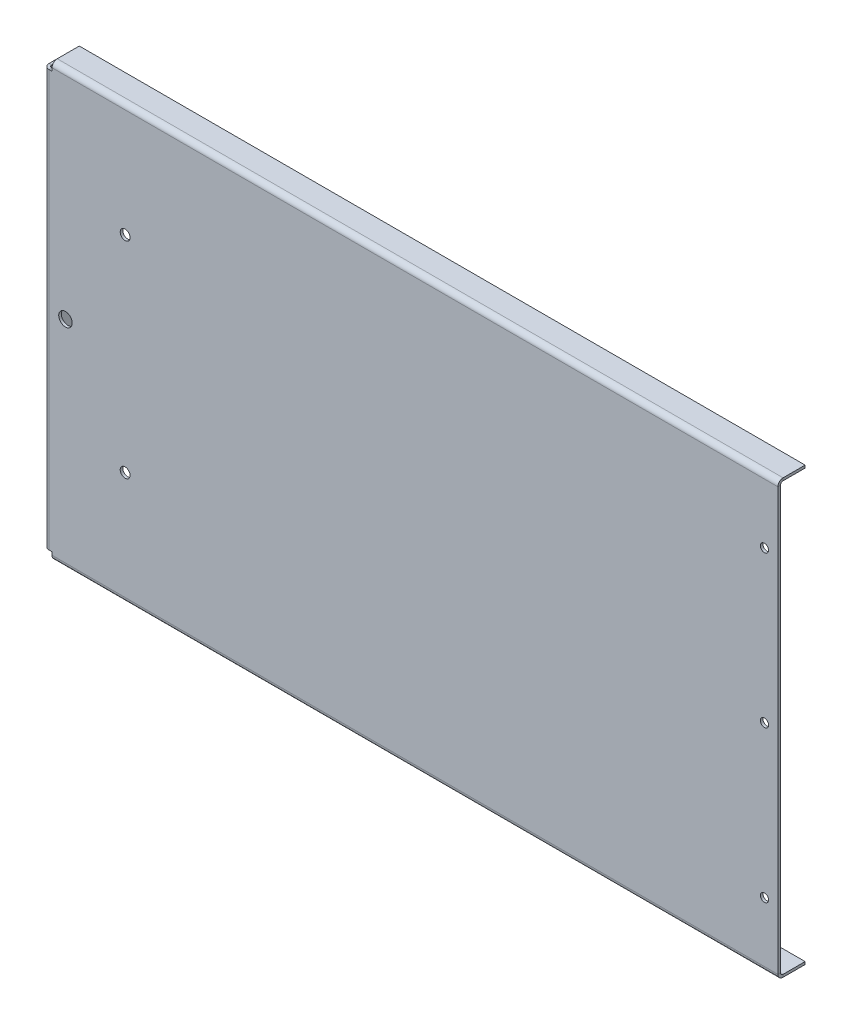
ISO-10303-21;
HEADER;
FILE_DESCRIPTION(('STEP AP214'),'2;1');
FILE_NAME('part.step','',(''),(''),'','','');
FILE_SCHEMA(('AUTOMOTIVE_DESIGN { 1 0 10303 214 1 1 1 1 }'));
ENDSEC;
DATA;
#1=APPLICATION_CONTEXT('core data for automotive mechanical design processes');
#2=APPLICATION_PROTOCOL_DEFINITION('international standard','automotive_design',2000,#1);
#3=PRODUCT_CONTEXT('',#1,'mechanical');
#4=PRODUCT('Part','Part','',(#3));
#5=PRODUCT_RELATED_PRODUCT_CATEGORY('part','',(#4));
#6=PRODUCT_DEFINITION_FORMATION('','',#4);
#7=PRODUCT_DEFINITION_CONTEXT('part definition',#1,'design');
#8=PRODUCT_DEFINITION('design','',#6,#7);
#9=PRODUCT_DEFINITION_SHAPE('','',#8);
#10=(LENGTH_UNIT() NAMED_UNIT(*) SI_UNIT(.MILLI.,.METRE.));
#11=(NAMED_UNIT(*) PLANE_ANGLE_UNIT() SI_UNIT($,.RADIAN.));
#12=(NAMED_UNIT(*) SI_UNIT($,.STERADIAN.) SOLID_ANGLE_UNIT());
#13=UNCERTAINTY_MEASURE_WITH_UNIT(LENGTH_MEASURE(1.E-05),#10,'distance_accuracy_value','');
#14=(GEOMETRIC_REPRESENTATION_CONTEXT(3) GLOBAL_UNCERTAINTY_ASSIGNED_CONTEXT((#13)) GLOBAL_UNIT_ASSIGNED_CONTEXT((#10,
#11,#12)) REPRESENTATION_CONTEXT('',''));
#15=CARTESIAN_POINT('',(0.,0.,0.));
#16=DIRECTION('',(0.,0.,1.));
#17=DIRECTION('',(1.,0.,0.));
#18=AXIS2_PLACEMENT_3D('',#15,#16,#17);
#19=CARTESIAN_POINT('',(0.,0.,-1.524));
#20=DIRECTION('',(0.,0.,-1.));
#21=DIRECTION('',(-1.,0.,0.));
#22=AXIS2_PLACEMENT_3D('',#19,#20,#21);
#23=PLANE('',#22);
#24=CARTESIAN_POINT('',(-202.819,0.,-1.524));
#25=DIRECTION('',(0.,0.,-1.));
#26=DIRECTION('',(-1.,0.,0.));
#27=AXIS2_PLACEMENT_3D('',#24,#25,#26);
#28=CIRCLE('',#27,3.9624);
#29=CARTESIAN_POINT('',(-206.7814,0.,-1.524));
#30=VERTEX_POINT('',#29);
#31=EDGE_CURVE('E571',#30,#30,#28,.F.);
#32=ORIENTED_EDGE('',*,*,#31,.T.);
#33=EDGE_LOOP('',(#32));
#34=FACE_BOUND('',#33,.T.);
#35=CARTESIAN_POINT('',(-167.767,60.452,-1.524));
#36=DIRECTION('',(0.,0.,-1.));
#37=DIRECTION('',(-1.,0.,0.));
#38=AXIS2_PLACEMENT_3D('',#35,#36,#37);
#39=CIRCLE('',#38,2.8956);
#40=CARTESIAN_POINT('',(-170.6626,60.452,-1.524));
#41=VERTEX_POINT('',#40);
#42=EDGE_CURVE('E567',#41,#41,#39,.F.);
#43=ORIENTED_EDGE('',*,*,#42,.T.);
#44=EDGE_LOOP('',(#43));
#45=FACE_BOUND('',#44,.T.);
#46=CARTESIAN_POINT('',(-167.767,-60.452,-1.524));
#47=DIRECTION('',(0.,0.,-1.));
#48=DIRECTION('',(-1.,0.,0.));
#49=AXIS2_PLACEMENT_3D('',#46,#47,#48);
#50=CIRCLE('',#49,2.8956);
#51=CARTESIAN_POINT('',(-170.6626,-60.452,-1.524));
#52=VERTEX_POINT('',#51);
#53=EDGE_CURVE('E559',#52,#52,#50,.F.);
#54=ORIENTED_EDGE('',*,*,#53,.T.);
#55=EDGE_LOOP('',(#54));
#56=FACE_BOUND('',#55,.T.);
#57=CARTESIAN_POINT('',(207.645,88.9,-1.524));
#58=DIRECTION('',(0.,0.,-1.));
#59=DIRECTION('',(-1.,0.,0.));
#60=AXIS2_PLACEMENT_3D('',#57,#58,#59);
#61=CIRCLE('',#60,2.41299999999999);
#62=CARTESIAN_POINT('',(205.232,88.9,-1.524));
#63=VERTEX_POINT('',#62);
#64=EDGE_CURVE('E551',#63,#63,#61,.F.);
#65=ORIENTED_EDGE('',*,*,#64,.T.);
#66=EDGE_LOOP('',(#65));
#67=FACE_BOUND('',#66,.T.);
#68=CARTESIAN_POINT('',(207.645,0.,-1.524));
#69=DIRECTION('',(0.,0.,-1.));
#70=DIRECTION('',(-1.,0.,0.));
#71=AXIS2_PLACEMENT_3D('',#68,#69,#70);
#72=CIRCLE('',#71,2.413);
#73=CARTESIAN_POINT('',(205.232,0.,-1.524));
#74=VERTEX_POINT('',#73);
#75=EDGE_CURVE('E543',#74,#74,#72,.F.);
#76=ORIENTED_EDGE('',*,*,#75,.T.);
#77=EDGE_LOOP('',(#76));
#78=FACE_BOUND('',#77,.T.);
#79=CARTESIAN_POINT('',(207.645,-88.9,-1.524));
#80=DIRECTION('',(0.,0.,-1.));
#81=DIRECTION('',(-1.,0.,0.));
#82=AXIS2_PLACEMENT_3D('',#79,#80,#81);
#83=CIRCLE('',#82,2.41299999999999);
#84=CARTESIAN_POINT('',(205.232,-88.9,-1.524));
#85=VERTEX_POINT('',#84);
#86=EDGE_CURVE('E535',#85,#85,#83,.F.);
#87=ORIENTED_EDGE('',*,*,#86,.T.);
#88=EDGE_LOOP('',(#87));
#89=FACE_BOUND('',#88,.T.);
#90=DIRECTION('',(-1.,0.,0.));
#91=VECTOR('',#90,1.);
#92=CARTESIAN_POINT('',(-215.519,-122.174,-1.524));
#93=LINE('',#92,#91);
#94=CARTESIAN_POINT('',(-210.693,-122.174,-1.524));
#95=VERTEX_POINT('',#94);
#96=CARTESIAN_POINT('',(-212.471,-122.174,-1.524));
#97=VERTEX_POINT('',#96);
#98=EDGE_CURVE('E502',#95,#97,#93,.T.);
#99=ORIENTED_EDGE('',*,*,#98,.T.);
#100=DIRECTION('',(0.,1.,0.));
#101=VECTOR('',#100,1.);
#102=CARTESIAN_POINT('',(-212.471,122.174,-1.524));
#103=LINE('',#102,#101);
#104=CARTESIAN_POINT('',(-212.471,122.174,-1.524));
#105=VERTEX_POINT('',#104);
#106=EDGE_CURVE('E315',#105,#97,#103,.F.);
#107=ORIENTED_EDGE('',*,*,#106,.F.);
#108=DIRECTION('',(1.,0.,0.));
#109=VECTOR('',#108,1.);
#110=CARTESIAN_POINT('',(-215.519,122.174,-1.524));
#111=LINE('',#110,#109);
#112=CARTESIAN_POINT('',(-210.693,122.174,-1.524));
#113=VERTEX_POINT('',#112);
#114=EDGE_CURVE('E490',#105,#113,#111,.T.);
#115=ORIENTED_EDGE('',*,*,#114,.T.);
#116=DIRECTION('',(0.,1.,0.));
#117=VECTOR('',#116,1.);
#118=CARTESIAN_POINT('',(-210.693,127.,-1.524));
#119=LINE('',#118,#117);
#120=CARTESIAN_POINT('',(-210.693,123.952,-1.524));
#121=VERTEX_POINT('',#120);
#122=EDGE_CURVE('E475',#113,#121,#119,.T.);
#123=ORIENTED_EDGE('',*,*,#122,.T.);
#124=DIRECTION('',(1.,0.,0.));
#125=VECTOR('',#124,1.);
#126=CARTESIAN_POINT('',(215.519,123.952,-1.524));
#127=LINE('',#126,#125);
#128=CARTESIAN_POINT('',(215.519,123.952,-1.524));
#129=VERTEX_POINT('',#128);
#130=EDGE_CURVE('E461',#129,#121,#127,.F.);
#131=ORIENTED_EDGE('',*,*,#130,.F.);
#132=DIRECTION('',(0.,1.,0.));
#133=VECTOR('',#132,1.);
#134=CARTESIAN_POINT('',(215.519,-127.,-1.524));
#135=LINE('',#134,#133);
#136=CARTESIAN_POINT('',(215.519,-123.952,-1.524));
#137=VERTEX_POINT('',#136);
#138=EDGE_CURVE('E13',#137,#129,#135,.T.);
#139=ORIENTED_EDGE('',*,*,#138,.F.);
#140=DIRECTION('',(-1.,0.,0.));
#141=VECTOR('',#140,1.);
#142=CARTESIAN_POINT('',(-210.693,-123.952,-1.524));
#143=LINE('',#142,#141);
#144=CARTESIAN_POINT('',(-210.693,-123.952,-1.524));
#145=VERTEX_POINT('',#144);
#146=EDGE_CURVE('E387',#145,#137,#143,.F.);
#147=ORIENTED_EDGE('',*,*,#146,.F.);
#148=DIRECTION('',(0.,1.,0.));
#149=VECTOR('',#148,1.);
#150=CARTESIAN_POINT('',(-210.693,-127.,-1.524));
#151=LINE('',#150,#149);
#152=EDGE_CURVE('E480',#145,#95,#151,.T.);
#153=ORIENTED_EDGE('',*,*,#152,.T.);
#154=EDGE_LOOP('',(#99,#107,#115,#123,#131,#139,#147,#153));
#155=FACE_BOUND('',#154,.T.);
#156=ADVANCED_FACE('F107',(#34,#45,#56,#67,#78,#89,#155),#23,.T.);
#157=CARTESIAN_POINT('',(0.,0.,0.));
#158=DIRECTION('',(0.,0.,-1.));
#159=DIRECTION('',(-1.,0.,0.));
#160=AXIS2_PLACEMENT_3D('',#157,#158,#159);
#161=PLANE('',#160);
#162=CARTESIAN_POINT('',(-202.819,0.,0.));
#163=DIRECTION('',(0.,0.,1.));
#164=DIRECTION('',(1.,0.,0.));
#165=AXIS2_PLACEMENT_3D('',#162,#163,#164);
#166=CIRCLE('',#165,3.9624);
#167=CARTESIAN_POINT('',(-198.8566,0.,0.));
#168=VERTEX_POINT('',#167);
#169=EDGE_CURVE('E299',#168,#168,#166,.T.);
#170=ORIENTED_EDGE('',*,*,#169,.F.);
#171=EDGE_LOOP('',(#170));
#172=FACE_BOUND('',#171,.T.);
#173=CARTESIAN_POINT('',(-167.767,60.452,0.));
#174=DIRECTION('',(0.,0.,1.));
#175=DIRECTION('',(1.,0.,0.));
#176=AXIS2_PLACEMENT_3D('',#173,#174,#175);
#177=CIRCLE('',#176,2.8956);
#178=CARTESIAN_POINT('',(-164.8714,60.452,0.));
#179=VERTEX_POINT('',#178);
#180=EDGE_CURVE('E563',#179,#179,#177,.T.);
#181=ORIENTED_EDGE('',*,*,#180,.F.);
#182=EDGE_LOOP('',(#181));
#183=FACE_BOUND('',#182,.T.);
#184=CARTESIAN_POINT('',(-167.767,-60.452,0.));
#185=DIRECTION('',(0.,0.,1.));
#186=DIRECTION('',(1.,0.,0.));
#187=AXIS2_PLACEMENT_3D('',#184,#185,#186);
#188=CIRCLE('',#187,2.8956);
#189=CARTESIAN_POINT('',(-164.8714,-60.452,0.));
#190=VERTEX_POINT('',#189);
#191=EDGE_CURVE('E555',#190,#190,#188,.T.);
#192=ORIENTED_EDGE('',*,*,#191,.F.);
#193=EDGE_LOOP('',(#192));
#194=FACE_BOUND('',#193,.T.);
#195=CARTESIAN_POINT('',(207.645,88.9,0.));
#196=DIRECTION('',(0.,0.,1.));
#197=DIRECTION('',(1.,0.,0.));
#198=AXIS2_PLACEMENT_3D('',#195,#196,#197);
#199=CIRCLE('',#198,2.41299999999999);
#200=CARTESIAN_POINT('',(210.058,88.9,0.));
#201=VERTEX_POINT('',#200);
#202=EDGE_CURVE('E547',#201,#201,#199,.T.);
#203=ORIENTED_EDGE('',*,*,#202,.F.);
#204=EDGE_LOOP('',(#203));
#205=FACE_BOUND('',#204,.T.);
#206=CARTESIAN_POINT('',(207.645,0.,0.));
#207=DIRECTION('',(0.,0.,1.));
#208=DIRECTION('',(1.,0.,0.));
#209=AXIS2_PLACEMENT_3D('',#206,#207,#208);
#210=CIRCLE('',#209,2.413);
#211=CARTESIAN_POINT('',(210.058,0.,0.));
#212=VERTEX_POINT('',#211);
#213=EDGE_CURVE('E539',#212,#212,#210,.T.);
#214=ORIENTED_EDGE('',*,*,#213,.F.);
#215=EDGE_LOOP('',(#214));
#216=FACE_BOUND('',#215,.T.);
#217=CARTESIAN_POINT('',(207.645,-88.9,0.));
#218=DIRECTION('',(0.,0.,1.));
#219=DIRECTION('',(1.,0.,0.));
#220=AXIS2_PLACEMENT_3D('',#217,#218,#219);
#221=CIRCLE('',#220,2.41299999999999);
#222=CARTESIAN_POINT('',(210.058,-88.9,0.));
#223=VERTEX_POINT('',#222);
#224=EDGE_CURVE('E531',#223,#223,#221,.T.);
#225=ORIENTED_EDGE('',*,*,#224,.F.);
#226=EDGE_LOOP('',(#225));
#227=FACE_BOUND('',#226,.T.);
#228=DIRECTION('',(0.,1.,0.));
#229=VECTOR('',#228,1.);
#230=CARTESIAN_POINT('',(-212.471,122.174,0.));
#231=LINE('',#230,#229);
#232=CARTESIAN_POINT('',(-212.471,122.174,0.));
#233=VERTEX_POINT('',#232);
#234=CARTESIAN_POINT('',(-212.471,-122.174,0.));
#235=VERTEX_POINT('',#234);
#236=EDGE_CURVE('E131',#233,#235,#231,.F.);
#237=ORIENTED_EDGE('',*,*,#236,.T.);
#238=DIRECTION('',(-1.,0.,0.));
#239=VECTOR('',#238,1.);
#240=CARTESIAN_POINT('',(-215.519,-122.174,0.));
#241=LINE('',#240,#239);
#242=CARTESIAN_POINT('',(-210.693,-122.174,0.));
#243=VERTEX_POINT('',#242);
#244=EDGE_CURVE('E496',#243,#235,#241,.T.);
#245=ORIENTED_EDGE('',*,*,#244,.F.);
#246=DIRECTION('',(0.,1.,0.));
#247=VECTOR('',#246,1.);
#248=CARTESIAN_POINT('',(-210.693,-127.,0.));
#249=LINE('',#248,#247);
#250=CARTESIAN_POINT('',(-210.693,-123.952,0.));
#251=VERTEX_POINT('',#250);
#252=EDGE_CURVE('E499',#251,#243,#249,.T.);
#253=ORIENTED_EDGE('',*,*,#252,.F.);
#254=DIRECTION('',(-1.,0.,0.));
#255=VECTOR('',#254,1.);
#256=CARTESIAN_POINT('',(-210.693,-123.952,0.));
#257=LINE('',#256,#255);
#258=CARTESIAN_POINT('',(215.519,-123.952,0.));
#259=VERTEX_POINT('',#258);
#260=EDGE_CURVE('E371',#251,#259,#257,.F.);
#261=ORIENTED_EDGE('',*,*,#260,.T.);
#262=DIRECTION('',(0.,1.,0.));
#263=VECTOR('',#262,1.);
#264=CARTESIAN_POINT('',(215.519,-127.,0.));
#265=LINE('',#264,#263);
#266=CARTESIAN_POINT('',(215.519,123.952,0.));
#267=VERTEX_POINT('',#266);
#268=EDGE_CURVE('E111',#259,#267,#265,.T.);
#269=ORIENTED_EDGE('',*,*,#268,.T.);
#270=DIRECTION('',(1.,0.,0.));
#271=VECTOR('',#270,1.);
#272=CARTESIAN_POINT('',(215.519,123.952,0.));
#273=LINE('',#272,#271);
#274=CARTESIAN_POINT('',(-210.693,123.952,0.));
#275=VERTEX_POINT('',#274);
#276=EDGE_CURVE('E444',#267,#275,#273,.F.);
#277=ORIENTED_EDGE('',*,*,#276,.T.);
#278=DIRECTION('',(0.,1.,0.));
#279=VECTOR('',#278,1.);
#280=CARTESIAN_POINT('',(-210.693,127.,0.));
#281=LINE('',#280,#279);
#282=CARTESIAN_POINT('',(-210.693,122.174,0.));
#283=VERTEX_POINT('',#282);
#284=EDGE_CURVE('E483',#283,#275,#281,.T.);
#285=ORIENTED_EDGE('',*,*,#284,.F.);
#286=DIRECTION('',(1.,0.,0.));
#287=VECTOR('',#286,1.);
#288=CARTESIAN_POINT('',(-215.519,122.174,0.));
#289=LINE('',#288,#287);
#290=EDGE_CURVE('E479',#233,#283,#289,.T.);
#291=ORIENTED_EDGE('',*,*,#290,.F.);
#292=EDGE_LOOP('',(#237,#245,#253,#261,#269,#277,#285,#291));
#293=FACE_BOUND('',#292,.T.);
#294=ADVANCED_FACE('F516',(#172,#183,#194,#205,#216,#227,#293),#161,.F.);
#295=CARTESIAN_POINT('',(-215.519,-122.174,-1.525));
#296=DIRECTION('',(0.,1.,0.));
#297=DIRECTION('',(0.,0.,1.));
#298=AXIS2_PLACEMENT_3D('',#295,#296,#297);
#299=PLANE('',#298);
#300=DIRECTION('',(0.,0.,1.));
#301=VECTOR('',#300,1.);
#302=CARTESIAN_POINT('',(-212.471,-122.174,-1.524));
#303=LINE('',#302,#301);
#304=EDGE_CURVE('E123',#97,#235,#303,.T.);
#305=ORIENTED_EDGE('',*,*,#304,.F.);
#306=ORIENTED_EDGE('',*,*,#98,.F.);
#307=DIRECTION('',(0.,0.,1.));
#308=VECTOR('',#307,1.);
#309=CARTESIAN_POINT('',(-210.693,-122.174,-1.525));
#310=LINE('',#309,#308);
#311=EDGE_CURVE('E472',#95,#243,#310,.T.);
#312=ORIENTED_EDGE('',*,*,#311,.T.);
#313=ORIENTED_EDGE('',*,*,#244,.T.);
#314=EDGE_LOOP('',(#305,#306,#312,#313));
#315=FACE_BOUND('',#314,.T.);
#316=ADVANCED_FACE('F513',(#315),#299,.F.);
#317=CARTESIAN_POINT('',(-215.519,122.174,-1.525));
#318=DIRECTION('',(0.,-1.,0.));
#319=DIRECTION('',(0.,0.,-1.));
#320=AXIS2_PLACEMENT_3D('',#317,#318,#319);
#321=PLANE('',#320);
#322=DIRECTION('',(0.,0.,1.));
#323=VECTOR('',#322,1.);
#324=CARTESIAN_POINT('',(-212.471,122.174,-1.524));
#325=LINE('',#324,#323);
#326=EDGE_CURVE('E307',#105,#233,#325,.T.);
#327=ORIENTED_EDGE('',*,*,#326,.T.);
#328=ORIENTED_EDGE('',*,*,#290,.T.);
#329=DIRECTION('',(0.,0.,1.));
#330=VECTOR('',#329,1.);
#331=CARTESIAN_POINT('',(-210.693,122.174,-1.525));
#332=LINE('',#331,#330);
#333=EDGE_CURVE('E486',#113,#283,#332,.T.);
#334=ORIENTED_EDGE('',*,*,#333,.F.);
#335=ORIENTED_EDGE('',*,*,#114,.F.);
#336=EDGE_LOOP('',(#327,#328,#334,#335));
#337=FACE_BOUND('',#336,.T.);
#338=ADVANCED_FACE('F618',(#337),#321,.F.);
#339=CARTESIAN_POINT('',(-210.693,-127.,-1.525));
#340=DIRECTION('',(1.,0.,0.));
#341=DIRECTION('',(0.,1.,0.));
#342=AXIS2_PLACEMENT_3D('',#339,#340,#341);
#343=PLANE('',#342);
#344=DIRECTION('',(0.,0.,1.));
#345=VECTOR('',#344,1.);
#346=CARTESIAN_POINT('',(-210.693,-123.952,-1.524));
#347=LINE('',#346,#345);
#348=EDGE_CURVE('E379',#145,#251,#347,.T.);
#349=ORIENTED_EDGE('',*,*,#348,.T.);
#350=ORIENTED_EDGE('',*,*,#252,.T.);
#351=ORIENTED_EDGE('',*,*,#311,.F.);
#352=ORIENTED_EDGE('',*,*,#152,.F.);
#353=EDGE_LOOP('',(#349,#350,#351,#352));
#354=FACE_BOUND('',#353,.T.);
#355=ADVANCED_FACE('F514',(#354),#343,.F.);
#356=CARTESIAN_POINT('',(215.519,-127.,-1.524));
#357=DIRECTION('',(1.,0.,0.));
#358=DIRECTION('',(0.,0.,-1.));
#359=AXIS2_PLACEMENT_3D('',#356,#357,#358);
#360=PLANE('',#359);
#361=DIRECTION('',(0.,0.,1.));
#362=VECTOR('',#361,1.);
#363=CARTESIAN_POINT('',(215.519,-123.952,-1.524));
#364=LINE('',#363,#362);
#365=EDGE_CURVE('E394',#137,#259,#364,.T.);
#366=ORIENTED_EDGE('',*,*,#365,.F.);
#367=ORIENTED_EDGE('',*,*,#138,.T.);
#368=DIRECTION('',(0.,0.,1.));
#369=VECTOR('',#368,1.);
#370=CARTESIAN_POINT('',(215.519,123.952,-1.524));
#371=LINE('',#370,#369);
#372=EDGE_CURVE('E453',#129,#267,#371,.T.);
#373=ORIENTED_EDGE('',*,*,#372,.T.);
#374=ORIENTED_EDGE('',*,*,#268,.F.);
#375=EDGE_LOOP('',(#366,#367,#373,#374));
#376=FACE_BOUND('',#375,.T.);
#377=ADVANCED_FACE('F109',(#376),#360,.T.);
#378=CARTESIAN_POINT('',(-210.693,127.,-1.525));
#379=DIRECTION('',(1.,0.,0.));
#380=DIRECTION('',(0.,0.,-1.));
#381=AXIS2_PLACEMENT_3D('',#378,#379,#380);
#382=PLANE('',#381);
#383=DIRECTION('',(0.,0.,1.));
#384=VECTOR('',#383,1.);
#385=CARTESIAN_POINT('',(-210.693,123.952,-1.524));
#386=LINE('',#385,#384);
#387=EDGE_CURVE('E468',#121,#275,#386,.T.);
#388=ORIENTED_EDGE('',*,*,#387,.F.);
#389=ORIENTED_EDGE('',*,*,#122,.F.);
#390=ORIENTED_EDGE('',*,*,#333,.T.);
#391=ORIENTED_EDGE('',*,*,#284,.T.);
#392=EDGE_LOOP('',(#388,#389,#390,#391));
#393=FACE_BOUND('',#392,.T.);
#394=ADVANCED_FACE('F624',(#393),#382,.F.);
#395=CARTESIAN_POINT('',(-210.693,123.952,-3.048));
#396=DIRECTION('',(-1.,0.,0.));
#397=DIRECTION('',(0.,0.,1.));
#398=AXIS2_PLACEMENT_3D('',#395,#396,#397);
#399=PLANE('',#398);
#400=DIRECTION('',(0.,-1.,0.));
#401=VECTOR('',#400,1.);
#402=CARTESIAN_POINT('',(-210.693,127.,-3.04799999999999));
#403=LINE('',#402,#401);
#404=CARTESIAN_POINT('',(-210.693,125.476,-3.048));
#405=VERTEX_POINT('',#404);
#406=CARTESIAN_POINT('',(-210.693,127.,-3.04799999999999));
#407=VERTEX_POINT('',#406);
#408=EDGE_CURVE('E398',#405,#407,#403,.F.);
#409=ORIENTED_EDGE('',*,*,#408,.F.);
#410=CARTESIAN_POINT('',(-210.693,123.952,-3.048));
#411=DIRECTION('',(1.,0.,0.));
#412=DIRECTION('',(0.,0.,-1.));
#413=AXIS2_PLACEMENT_3D('',#410,#411,#412);
#414=CIRCLE('',#413,1.524);
#415=EDGE_CURVE('E457',#121,#405,#414,.F.);
#416=ORIENTED_EDGE('',*,*,#415,.F.);
#417=ORIENTED_EDGE('',*,*,#387,.T.);
#418=CARTESIAN_POINT('',(-210.693,123.952,-3.048));
#419=DIRECTION('',(1.,0.,0.));
#420=DIRECTION('',(0.,0.,-1.));
#421=AXIS2_PLACEMENT_3D('',#418,#419,#420);
#422=CIRCLE('',#421,3.048);
#423=EDGE_CURVE('E448',#275,#407,#422,.F.);
#424=ORIENTED_EDGE('',*,*,#423,.T.);
#425=EDGE_LOOP('',(#409,#416,#417,#424));
#426=FACE_BOUND('',#425,.T.);
#427=ADVANCED_FACE('F627',(#426),#399,.T.);
#428=CARTESIAN_POINT('',(215.519,123.952,-3.048));
#429=DIRECTION('',(-1.,0.,0.));
#430=DIRECTION('',(0.,0.,1.));
#431=AXIS2_PLACEMENT_3D('',#428,#429,#430);
#432=PLANE('',#431);
#433=CARTESIAN_POINT('',(215.519,123.952,-3.048));
#434=DIRECTION('',(1.,0.,0.));
#435=DIRECTION('',(0.,0.,-1.));
#436=AXIS2_PLACEMENT_3D('',#433,#434,#435);
#437=CIRCLE('',#436,1.524);
#438=CARTESIAN_POINT('',(215.519,125.476,-3.048));
#439=VERTEX_POINT('',#438);
#440=EDGE_CURVE('E406',#439,#129,#437,.T.);
#441=ORIENTED_EDGE('',*,*,#440,.F.);
#442=DIRECTION('',(0.,-1.,0.));
#443=VECTOR('',#442,1.);
#444=CARTESIAN_POINT('',(215.519,125.476,-3.048));
#445=LINE('',#444,#443);
#446=CARTESIAN_POINT('',(215.519,127.,-3.04799999999999));
#447=VERTEX_POINT('',#446);
#448=EDGE_CURVE('E434',#439,#447,#445,.F.);
#449=ORIENTED_EDGE('',*,*,#448,.T.);
#450=CARTESIAN_POINT('',(215.519,123.952,-3.048));
#451=DIRECTION('',(1.,0.,0.));
#452=DIRECTION('',(0.,0.,-1.));
#453=AXIS2_PLACEMENT_3D('',#450,#451,#452);
#454=CIRCLE('',#453,3.048);
#455=EDGE_CURVE('E449',#447,#267,#454,.T.);
#456=ORIENTED_EDGE('',*,*,#455,.T.);
#457=ORIENTED_EDGE('',*,*,#372,.F.);
#458=EDGE_LOOP('',(#441,#449,#456,#457));
#459=FACE_BOUND('',#458,.T.);
#460=ADVANCED_FACE('F629',(#459),#432,.F.);
#461=CARTESIAN_POINT('',(215.519,123.952,-3.048));
#462=DIRECTION('',(1.,0.,0.));
#463=DIRECTION('',(0.,1.,0.));
#464=AXIS2_PLACEMENT_3D('',#461,#462,#463);
#465=CYLINDRICAL_SURFACE('',#464,3.048);
#466=ORIENTED_EDGE('',*,*,#276,.F.);
#467=ORIENTED_EDGE('',*,*,#455,.F.);
#468=DIRECTION('',(1.,0.,0.));
#469=VECTOR('',#468,1.);
#470=CARTESIAN_POINT('',(-210.693,127.,-3.04799999999999));
#471=LINE('',#470,#469);
#472=EDGE_CURVE('E431',#447,#407,#471,.F.);
#473=ORIENTED_EDGE('',*,*,#472,.T.);
#474=ORIENTED_EDGE('',*,*,#423,.F.);
#475=EDGE_LOOP('',(#466,#467,#473,#474));
#476=FACE_BOUND('',#475,.T.);
#477=ADVANCED_FACE('F632',(#476),#465,.T.);
#478=CARTESIAN_POINT('',(215.519,123.952,-3.048));
#479=DIRECTION('',(1.,0.,0.));
#480=DIRECTION('',(0.,1.,0.));
#481=AXIS2_PLACEMENT_3D('',#478,#479,#480);
#482=CYLINDRICAL_SURFACE('',#481,1.524);
#483=ORIENTED_EDGE('',*,*,#130,.T.);
#484=ORIENTED_EDGE('',*,*,#415,.T.);
#485=DIRECTION('',(1.,0.,0.));
#486=VECTOR('',#485,1.);
#487=CARTESIAN_POINT('',(-210.693,125.476,-3.048));
#488=LINE('',#487,#486);
#489=EDGE_CURVE('E438',#405,#439,#488,.T.);
#490=ORIENTED_EDGE('',*,*,#489,.T.);
#491=ORIENTED_EDGE('',*,*,#440,.T.);
#492=EDGE_LOOP('',(#483,#484,#490,#491));
#493=FACE_BOUND('',#492,.T.);
#494=ADVANCED_FACE('F637',(#493),#482,.F.);
#495=CARTESIAN_POINT('',(215.519,127.,-16.002));
#496=DIRECTION('',(-1.,0.,0.));
#497=DIRECTION('',(0.,0.,1.));
#498=AXIS2_PLACEMENT_3D('',#495,#496,#497);
#499=PLANE('',#498);
#500=ORIENTED_EDGE('',*,*,#448,.F.);
#501=DIRECTION('',(0.,0.,1.));
#502=VECTOR('',#501,1.);
#503=CARTESIAN_POINT('',(215.519,125.476,-16.002));
#504=LINE('',#503,#502);
#505=CARTESIAN_POINT('',(215.519,125.476,-16.002));
#506=VERTEX_POINT('',#505);
#507=EDGE_CURVE('E428',#439,#506,#504,.F.);
#508=ORIENTED_EDGE('',*,*,#507,.T.);
#509=DIRECTION('',(0.,-1.,0.));
#510=VECTOR('',#509,1.);
#511=CARTESIAN_POINT('',(215.519,127.,-16.002));
#512=LINE('',#511,#510);
#513=CARTESIAN_POINT('',(215.519,127.,-16.002));
#514=VERTEX_POINT('',#513);
#515=EDGE_CURVE('E402',#514,#506,#512,.T.);
#516=ORIENTED_EDGE('',*,*,#515,.F.);
#517=DIRECTION('',(0.,0.,-1.));
#518=VECTOR('',#517,1.);
#519=CARTESIAN_POINT('',(215.519,127.,-3.34076108827205E-13));
#520=LINE('',#519,#518);
#521=EDGE_CURVE('E418',#447,#514,#520,.T.);
#522=ORIENTED_EDGE('',*,*,#521,.F.);
#523=EDGE_LOOP('',(#500,#508,#516,#522));
#524=FACE_BOUND('',#523,.T.);
#525=ADVANCED_FACE('F640',(#524),#499,.F.);
#526=CARTESIAN_POINT('',(-210.693,127.,-1.52399999999999));
#527=DIRECTION('',(1.,0.,0.));
#528=DIRECTION('',(0.,0.,-1.));
#529=AXIS2_PLACEMENT_3D('',#526,#527,#528);
#530=PLANE('',#529);
#531=ORIENTED_EDGE('',*,*,#408,.T.);
#532=DIRECTION('',(0.,0.,1.));
#533=VECTOR('',#532,1.);
#534=CARTESIAN_POINT('',(-210.693,127.,1.30009427303333E-12));
#535=LINE('',#534,#533);
#536=CARTESIAN_POINT('',(-210.693,127.,-16.002));
#537=VERTEX_POINT('',#536);
#538=EDGE_CURVE('E411',#537,#407,#535,.T.);
#539=ORIENTED_EDGE('',*,*,#538,.F.);
#540=DIRECTION('',(0.,-1.,0.));
#541=VECTOR('',#540,1.);
#542=CARTESIAN_POINT('',(-210.693,127.,-16.002));
#543=LINE('',#542,#541);
#544=CARTESIAN_POINT('',(-210.693,125.476,-16.002));
#545=VERTEX_POINT('',#544);
#546=EDGE_CURVE('E407',#537,#545,#543,.T.);
#547=ORIENTED_EDGE('',*,*,#546,.T.);
#548=DIRECTION('',(0.,0.,-1.));
#549=VECTOR('',#548,1.);
#550=CARTESIAN_POINT('',(-210.693,125.476,-1.524));
#551=LINE('',#550,#549);
#552=EDGE_CURVE('E421',#545,#405,#551,.F.);
#553=ORIENTED_EDGE('',*,*,#552,.T.);
#554=EDGE_LOOP('',(#531,#539,#547,#553));
#555=FACE_BOUND('',#554,.T.);
#556=ADVANCED_FACE('F647',(#555),#530,.F.);
#557=CARTESIAN_POINT('',(0.,127.,4.92260940641606E-13));
#558=DIRECTION('',(0.,-1.,0.));
#559=DIRECTION('',(0.,0.,-1.));
#560=AXIS2_PLACEMENT_3D('',#557,#558,#559);
#561=PLANE('',#560);
#562=ORIENTED_EDGE('',*,*,#472,.F.);
#563=ORIENTED_EDGE('',*,*,#521,.T.);
#564=DIRECTION('',(-1.,0.,0.));
#565=VECTOR('',#564,1.);
#566=CARTESIAN_POINT('',(0.,127.,-16.002));
#567=LINE('',#566,#565);
#568=EDGE_CURVE('E415',#514,#537,#567,.T.);
#569=ORIENTED_EDGE('',*,*,#568,.T.);
#570=ORIENTED_EDGE('',*,*,#538,.T.);
#571=EDGE_LOOP('',(#562,#563,#569,#570));
#572=FACE_BOUND('',#571,.T.);
#573=ADVANCED_FACE('F657',(#572),#561,.F.);
#574=CARTESIAN_POINT('',(0.,125.476,4.86939923081209E-13));
#575=DIRECTION('',(0.,-1.,0.));
#576=DIRECTION('',(0.,0.,-1.));
#577=AXIS2_PLACEMENT_3D('',#574,#575,#576);
#578=PLANE('',#577);
#579=ORIENTED_EDGE('',*,*,#507,.F.);
#580=ORIENTED_EDGE('',*,*,#489,.F.);
#581=ORIENTED_EDGE('',*,*,#552,.F.);
#582=DIRECTION('',(1.,0.,0.));
#583=VECTOR('',#582,1.);
#584=CARTESIAN_POINT('',(-210.693,125.476,-16.002));
#585=LINE('',#584,#583);
#586=EDGE_CURVE('E425',#506,#545,#585,.F.);
#587=ORIENTED_EDGE('',*,*,#586,.F.);
#588=EDGE_LOOP('',(#579,#580,#581,#587));
#589=FACE_BOUND('',#588,.T.);
#590=ADVANCED_FACE('F653',(#589),#578,.T.);
#591=CARTESIAN_POINT('',(-210.693,127.,-16.002));
#592=DIRECTION('',(0.,0.,1.));
#593=DIRECTION('',(0.,-1.,0.));
#594=AXIS2_PLACEMENT_3D('',#591,#592,#593);
#595=PLANE('',#594);
#596=ORIENTED_EDGE('',*,*,#586,.T.);
#597=ORIENTED_EDGE('',*,*,#546,.F.);
#598=ORIENTED_EDGE('',*,*,#568,.F.);
#599=ORIENTED_EDGE('',*,*,#515,.T.);
#600=EDGE_LOOP('',(#596,#597,#598,#599));
#601=FACE_BOUND('',#600,.T.);
#602=ADVANCED_FACE('F649',(#601),#595,.F.);
#603=CARTESIAN_POINT('',(215.519,-123.952,-3.048));
#604=DIRECTION('',(1.,0.,0.));
#605=DIRECTION('',(0.,0.,-1.));
#606=AXIS2_PLACEMENT_3D('',#603,#604,#605);
#607=PLANE('',#606);
#608=DIRECTION('',(0.,1.,0.));
#609=VECTOR('',#608,1.);
#610=CARTESIAN_POINT('',(215.519,-127.,-3.04799999999999));
#611=LINE('',#610,#609);
#612=CARTESIAN_POINT('',(215.519,-125.476,-3.048));
#613=VERTEX_POINT('',#612);
#614=CARTESIAN_POINT('',(215.519,-127.,-3.04799999999999));
#615=VERTEX_POINT('',#614);
#616=EDGE_CURVE('E325',#613,#615,#611,.F.);
#617=ORIENTED_EDGE('',*,*,#616,.F.);
#618=CARTESIAN_POINT('',(215.519,-123.952,-3.048));
#619=DIRECTION('',(-1.,0.,0.));
#620=DIRECTION('',(0.,0.,1.));
#621=AXIS2_PLACEMENT_3D('',#618,#619,#620);
#622=CIRCLE('',#621,1.524);
#623=EDGE_CURVE('E383',#137,#613,#622,.F.);
#624=ORIENTED_EDGE('',*,*,#623,.F.);
#625=ORIENTED_EDGE('',*,*,#365,.T.);
#626=CARTESIAN_POINT('',(215.519,-123.952,-3.048));
#627=DIRECTION('',(-1.,0.,0.));
#628=DIRECTION('',(0.,0.,1.));
#629=AXIS2_PLACEMENT_3D('',#626,#627,#628);
#630=CIRCLE('',#629,3.048);
#631=EDGE_CURVE('E374',#259,#615,#630,.F.);
#632=ORIENTED_EDGE('',*,*,#631,.T.);
#633=EDGE_LOOP('',(#617,#624,#625,#632));
#634=FACE_BOUND('',#633,.T.);
#635=ADVANCED_FACE('F652',(#634),#607,.T.);
#636=CARTESIAN_POINT('',(-210.693,-123.952,-3.048));
#637=DIRECTION('',(1.,0.,0.));
#638=DIRECTION('',(0.,0.,-1.));
#639=AXIS2_PLACEMENT_3D('',#636,#637,#638);
#640=PLANE('',#639);
#641=CARTESIAN_POINT('',(-210.693,-123.952,-3.048));
#642=DIRECTION('',(-1.,0.,0.));
#643=DIRECTION('',(0.,0.,1.));
#644=AXIS2_PLACEMENT_3D('',#641,#642,#643);
#645=CIRCLE('',#644,1.524);
#646=CARTESIAN_POINT('',(-210.693,-125.476,-3.048));
#647=VERTEX_POINT('',#646);
#648=EDGE_CURVE('E333',#647,#145,#645,.T.);
#649=ORIENTED_EDGE('',*,*,#648,.F.);
#650=DIRECTION('',(0.,1.,0.));
#651=VECTOR('',#650,1.);
#652=CARTESIAN_POINT('',(-210.693,-125.476,-3.048));
#653=LINE('',#652,#651);
#654=CARTESIAN_POINT('',(-210.693,-127.,-3.04799999999999));
#655=VERTEX_POINT('',#654);
#656=EDGE_CURVE('E361',#647,#655,#653,.F.);
#657=ORIENTED_EDGE('',*,*,#656,.T.);
#658=CARTESIAN_POINT('',(-210.693,-123.952,-3.048));
#659=DIRECTION('',(-1.,0.,0.));
#660=DIRECTION('',(0.,0.,1.));
#661=AXIS2_PLACEMENT_3D('',#658,#659,#660);
#662=CIRCLE('',#661,3.048);
#663=EDGE_CURVE('E375',#655,#251,#662,.T.);
#664=ORIENTED_EDGE('',*,*,#663,.T.);
#665=ORIENTED_EDGE('',*,*,#348,.F.);
#666=EDGE_LOOP('',(#649,#657,#664,#665));
#667=FACE_BOUND('',#666,.T.);
#668=ADVANCED_FACE('F665',(#667),#640,.F.);
#669=CARTESIAN_POINT('',(-210.693,-123.952,-3.048));
#670=DIRECTION('',(-1.,0.,0.));
#671=DIRECTION('',(0.,-1.,0.));
#672=AXIS2_PLACEMENT_3D('',#669,#670,#671);
#673=CYLINDRICAL_SURFACE('',#672,3.048);
#674=ORIENTED_EDGE('',*,*,#260,.F.);
#675=ORIENTED_EDGE('',*,*,#663,.F.);
#676=DIRECTION('',(-1.,0.,0.));
#677=VECTOR('',#676,1.);
#678=CARTESIAN_POINT('',(215.519,-127.,-3.04799999999999));
#679=LINE('',#678,#677);
#680=EDGE_CURVE('E358',#655,#615,#679,.F.);
#681=ORIENTED_EDGE('',*,*,#680,.T.);
#682=ORIENTED_EDGE('',*,*,#631,.F.);
#683=EDGE_LOOP('',(#674,#675,#681,#682));
#684=FACE_BOUND('',#683,.T.);
#685=ADVANCED_FACE('F668',(#684),#673,.T.);
#686=CARTESIAN_POINT('',(-210.693,-123.952,-3.048));
#687=DIRECTION('',(-1.,0.,0.));
#688=DIRECTION('',(0.,-1.,0.));
#689=AXIS2_PLACEMENT_3D('',#686,#687,#688);
#690=CYLINDRICAL_SURFACE('',#689,1.524);
#691=ORIENTED_EDGE('',*,*,#146,.T.);
#692=ORIENTED_EDGE('',*,*,#623,.T.);
#693=DIRECTION('',(-1.,0.,0.));
#694=VECTOR('',#693,1.);
#695=CARTESIAN_POINT('',(215.519,-125.476,-3.048));
#696=LINE('',#695,#694);
#697=EDGE_CURVE('E365',#613,#647,#696,.T.);
#698=ORIENTED_EDGE('',*,*,#697,.T.);
#699=ORIENTED_EDGE('',*,*,#648,.T.);
#700=EDGE_LOOP('',(#691,#692,#698,#699));
#701=FACE_BOUND('',#700,.T.);
#702=ADVANCED_FACE('F673',(#701),#690,.F.);
#703=CARTESIAN_POINT('',(-210.693,-127.,-16.002));
#704=DIRECTION('',(1.,0.,0.));
#705=DIRECTION('',(0.,0.,-1.));
#706=AXIS2_PLACEMENT_3D('',#703,#704,#705);
#707=PLANE('',#706);
#708=ORIENTED_EDGE('',*,*,#656,.F.);
#709=DIRECTION('',(0.,0.,1.));
#710=VECTOR('',#709,1.);
#711=CARTESIAN_POINT('',(-210.693,-125.476,-16.002));
#712=LINE('',#711,#710);
#713=CARTESIAN_POINT('',(-210.693,-125.476,-16.002));
#714=VERTEX_POINT('',#713);
#715=EDGE_CURVE('E355',#647,#714,#712,.F.);
#716=ORIENTED_EDGE('',*,*,#715,.T.);
#717=DIRECTION('',(0.,1.,0.));
#718=VECTOR('',#717,1.);
#719=CARTESIAN_POINT('',(-210.693,-127.,-16.002));
#720=LINE('',#719,#718);
#721=CARTESIAN_POINT('',(-210.693,-127.,-16.002));
#722=VERTEX_POINT('',#721);
#723=EDGE_CURVE('E329',#722,#714,#720,.T.);
#724=ORIENTED_EDGE('',*,*,#723,.F.);
#725=DIRECTION('',(0.,0.,-1.));
#726=VECTOR('',#725,1.);
#727=CARTESIAN_POINT('',(-210.693,-127.,1.30009427303333E-12));
#728=LINE('',#727,#726);
#729=EDGE_CURVE('E345',#655,#722,#728,.T.);
#730=ORIENTED_EDGE('',*,*,#729,.F.);
#731=EDGE_LOOP('',(#708,#716,#724,#730));
#732=FACE_BOUND('',#731,.T.);
#733=ADVANCED_FACE('F676',(#732),#707,.F.);
#734=CARTESIAN_POINT('',(215.519,-127.,-1.52399999999999));
#735=DIRECTION('',(-1.,0.,0.));
#736=DIRECTION('',(0.,0.,1.));
#737=AXIS2_PLACEMENT_3D('',#734,#735,#736);
#738=PLANE('',#737);
#739=ORIENTED_EDGE('',*,*,#616,.T.);
#740=DIRECTION('',(0.,0.,1.));
#741=VECTOR('',#740,1.);
#742=CARTESIAN_POINT('',(215.519,-127.,-3.34076108827205E-13));
#743=LINE('',#742,#741);
#744=CARTESIAN_POINT('',(215.519,-127.,-16.002));
#745=VERTEX_POINT('',#744);
#746=EDGE_CURVE('E338',#745,#615,#743,.T.);
#747=ORIENTED_EDGE('',*,*,#746,.F.);
#748=DIRECTION('',(0.,1.,0.));
#749=VECTOR('',#748,1.);
#750=CARTESIAN_POINT('',(215.519,-127.,-16.002));
#751=LINE('',#750,#749);
#752=CARTESIAN_POINT('',(215.519,-125.476,-16.002));
#753=VERTEX_POINT('',#752);
#754=EDGE_CURVE('E334',#745,#753,#751,.T.);
#755=ORIENTED_EDGE('',*,*,#754,.T.);
#756=DIRECTION('',(0.,0.,-1.));
#757=VECTOR('',#756,1.);
#758=CARTESIAN_POINT('',(215.519,-125.476,-1.524));
#759=LINE('',#758,#757);
#760=EDGE_CURVE('E348',#753,#613,#759,.F.);
#761=ORIENTED_EDGE('',*,*,#760,.T.);
#762=EDGE_LOOP('',(#739,#747,#755,#761));
#763=FACE_BOUND('',#762,.T.);
#764=ADVANCED_FACE('F683',(#763),#738,.F.);
#765=CARTESIAN_POINT('',(0.,-127.,4.92260940641606E-13));
#766=DIRECTION('',(0.,1.,0.));
#767=DIRECTION('',(0.,0.,1.));
#768=AXIS2_PLACEMENT_3D('',#765,#766,#767);
#769=PLANE('',#768);
#770=ORIENTED_EDGE('',*,*,#680,.F.);
#771=ORIENTED_EDGE('',*,*,#729,.T.);
#772=DIRECTION('',(1.,0.,0.));
#773=VECTOR('',#772,1.);
#774=CARTESIAN_POINT('',(0.,-127.,-16.002));
#775=LINE('',#774,#773);
#776=EDGE_CURVE('E342',#722,#745,#775,.T.);
#777=ORIENTED_EDGE('',*,*,#776,.T.);
#778=ORIENTED_EDGE('',*,*,#746,.T.);
#779=EDGE_LOOP('',(#770,#771,#777,#778));
#780=FACE_BOUND('',#779,.T.);
#781=ADVANCED_FACE('F692',(#780),#769,.F.);
#782=CARTESIAN_POINT('',(0.,-125.476,4.86939923081209E-13));
#783=DIRECTION('',(0.,1.,0.));
#784=DIRECTION('',(0.,0.,1.));
#785=AXIS2_PLACEMENT_3D('',#782,#783,#784);
#786=PLANE('',#785);
#787=ORIENTED_EDGE('',*,*,#715,.F.);
#788=ORIENTED_EDGE('',*,*,#697,.F.);
#789=ORIENTED_EDGE('',*,*,#760,.F.);
#790=DIRECTION('',(-1.,0.,0.));
#791=VECTOR('',#790,1.);
#792=CARTESIAN_POINT('',(215.519,-125.476,-16.002));
#793=LINE('',#792,#791);
#794=EDGE_CURVE('E352',#714,#753,#793,.F.);
#795=ORIENTED_EDGE('',*,*,#794,.F.);
#796=EDGE_LOOP('',(#787,#788,#789,#795));
#797=FACE_BOUND('',#796,.T.);
#798=ADVANCED_FACE('F688',(#797),#786,.T.);
#799=CARTESIAN_POINT('',(215.519,-127.,-16.002));
#800=DIRECTION('',(0.,0.,1.));
#801=DIRECTION('',(0.,-1.,0.));
#802=AXIS2_PLACEMENT_3D('',#799,#800,#801);
#803=PLANE('',#802);
#804=ORIENTED_EDGE('',*,*,#794,.T.);
#805=ORIENTED_EDGE('',*,*,#754,.F.);
#806=ORIENTED_EDGE('',*,*,#776,.F.);
#807=ORIENTED_EDGE('',*,*,#723,.T.);
#808=EDGE_LOOP('',(#804,#805,#806,#807));
#809=FACE_BOUND('',#808,.T.);
#810=ADVANCED_FACE('F685',(#809),#803,.F.);
#811=CARTESIAN_POINT('',(-212.471,-122.174,-3.048));
#812=DIRECTION('',(0.,-1.,0.));
#813=DIRECTION('',(0.,0.,-1.));
#814=AXIS2_PLACEMENT_3D('',#811,#812,#813);
#815=PLANE('',#814);
#816=DIRECTION('',(1.,0.,0.));
#817=VECTOR('',#816,1.);
#818=CARTESIAN_POINT('',(-215.519,-122.174,-3.04799999999999));
#819=LINE('',#818,#817);
#820=CARTESIAN_POINT('',(-213.995,-122.174,-3.048));
#821=VERTEX_POINT('',#820);
#822=CARTESIAN_POINT('',(-215.519,-122.174,-3.04799999999999));
#823=VERTEX_POINT('',#822);
#824=EDGE_CURVE('E272',#821,#823,#819,.F.);
#825=ORIENTED_EDGE('',*,*,#824,.F.);
#826=CARTESIAN_POINT('',(-212.471,-122.174,-3.048));
#827=DIRECTION('',(0.,1.,0.));
#828=DIRECTION('',(0.,0.,1.));
#829=AXIS2_PLACEMENT_3D('',#826,#827,#828);
#830=CIRCLE('',#829,1.524);
#831=EDGE_CURVE('E311',#97,#821,#830,.F.);
#832=ORIENTED_EDGE('',*,*,#831,.F.);
#833=ORIENTED_EDGE('',*,*,#304,.T.);
#834=CARTESIAN_POINT('',(-212.471,-122.174,-3.048));
#835=DIRECTION('',(0.,1.,0.));
#836=DIRECTION('',(0.,0.,1.));
#837=AXIS2_PLACEMENT_3D('',#834,#835,#836);
#838=CIRCLE('',#837,3.048);
#839=EDGE_CURVE('E302',#235,#823,#838,.F.);
#840=ORIENTED_EDGE('',*,*,#839,.T.);
#841=EDGE_LOOP('',(#825,#832,#833,#840));
#842=FACE_BOUND('',#841,.T.);
#843=ADVANCED_FACE('F522',(#842),#815,.T.);
#844=CARTESIAN_POINT('',(-212.471,122.174,-3.048));
#845=DIRECTION('',(0.,-1.,0.));
#846=DIRECTION('',(0.,0.,-1.));
#847=AXIS2_PLACEMENT_3D('',#844,#845,#846);
#848=PLANE('',#847);
#849=CARTESIAN_POINT('',(-212.471,122.174,-3.048));
#850=DIRECTION('',(0.,1.,0.));
#851=DIRECTION('',(0.,0.,1.));
#852=AXIS2_PLACEMENT_3D('',#849,#850,#851);
#853=CIRCLE('',#852,1.524);
#854=CARTESIAN_POINT('',(-213.995,122.174,-3.048));
#855=VERTEX_POINT('',#854);
#856=EDGE_CURVE('E319',#855,#105,#853,.T.);
#857=ORIENTED_EDGE('',*,*,#856,.F.);
#858=DIRECTION('',(1.,0.,0.));
#859=VECTOR('',#858,1.);
#860=CARTESIAN_POINT('',(-213.995,122.174,-3.048));
#861=LINE('',#860,#859);
#862=CARTESIAN_POINT('',(-215.519,122.174,-3.04799999999999));
#863=VERTEX_POINT('',#862);
#864=EDGE_CURVE('E290',#855,#863,#861,.F.);
#865=ORIENTED_EDGE('',*,*,#864,.T.);
#866=CARTESIAN_POINT('',(-212.471,122.174,-3.048));
#867=DIRECTION('',(0.,1.,0.));
#868=DIRECTION('',(0.,0.,1.));
#869=AXIS2_PLACEMENT_3D('',#866,#867,#868);
#870=CIRCLE('',#869,3.048);
#871=EDGE_CURVE('E303',#863,#233,#870,.T.);
#872=ORIENTED_EDGE('',*,*,#871,.T.);
#873=ORIENTED_EDGE('',*,*,#326,.F.);
#874=EDGE_LOOP('',(#857,#865,#872,#873));
#875=FACE_BOUND('',#874,.T.);
#876=ADVANCED_FACE('F700',(#875),#848,.F.);
#877=CARTESIAN_POINT('',(-212.471,122.174,-3.048));
#878=DIRECTION('',(0.,1.,0.));
#879=DIRECTION('',(-1.,0.,0.));
#880=AXIS2_PLACEMENT_3D('',#877,#878,#879);
#881=CYLINDRICAL_SURFACE('',#880,3.048);
#882=ORIENTED_EDGE('',*,*,#236,.F.);
#883=ORIENTED_EDGE('',*,*,#871,.F.);
#884=DIRECTION('',(0.,1.,0.));
#885=VECTOR('',#884,1.);
#886=CARTESIAN_POINT('',(-215.519,-122.174,-3.04799999999999));
#887=LINE('',#886,#885);
#888=EDGE_CURVE('E287',#863,#823,#887,.F.);
#889=ORIENTED_EDGE('',*,*,#888,.T.);
#890=ORIENTED_EDGE('',*,*,#839,.F.);
#891=EDGE_LOOP('',(#882,#883,#889,#890));
#892=FACE_BOUND('',#891,.T.);
#893=ADVANCED_FACE('F524',(#892),#881,.T.);
#894=CARTESIAN_POINT('',(-212.471,122.174,-3.048));
#895=DIRECTION('',(0.,1.,0.));
#896=DIRECTION('',(-1.,0.,0.));
#897=AXIS2_PLACEMENT_3D('',#894,#895,#896);
#898=CYLINDRICAL_SURFACE('',#897,1.524);
#899=ORIENTED_EDGE('',*,*,#106,.T.);
#900=ORIENTED_EDGE('',*,*,#831,.T.);
#901=DIRECTION('',(0.,1.,0.));
#902=VECTOR('',#901,1.);
#903=CARTESIAN_POINT('',(-213.995,-122.174,-3.048));
#904=LINE('',#903,#902);
#905=EDGE_CURVE('E294',#821,#855,#904,.T.);
#906=ORIENTED_EDGE('',*,*,#905,.T.);
#907=ORIENTED_EDGE('',*,*,#856,.T.);
#908=EDGE_LOOP('',(#899,#900,#906,#907));
#909=FACE_BOUND('',#908,.T.);
#910=ADVANCED_FACE('F706',(#909),#898,.F.);
#911=CARTESIAN_POINT('',(-215.519,122.174,-16.002));
#912=DIRECTION('',(0.,-1.,0.));
#913=DIRECTION('',(0.,0.,-1.));
#914=AXIS2_PLACEMENT_3D('',#911,#912,#913);
#915=PLANE('',#914);
#916=ORIENTED_EDGE('',*,*,#864,.F.);
#917=DIRECTION('',(0.,0.,1.));
#918=VECTOR('',#917,1.);
#919=CARTESIAN_POINT('',(-213.995,122.174,-16.002));
#920=LINE('',#919,#918);
#921=CARTESIAN_POINT('',(-213.995,122.174,-16.002));
#922=VERTEX_POINT('',#921);
#923=EDGE_CURVE('E284',#855,#922,#920,.F.);
#924=ORIENTED_EDGE('',*,*,#923,.T.);
#925=DIRECTION('',(1.,0.,0.));
#926=VECTOR('',#925,1.);
#927=CARTESIAN_POINT('',(-215.519,122.174,-16.002));
#928=LINE('',#927,#926);
#929=CARTESIAN_POINT('',(-215.519,122.174,-16.002));
#930=VERTEX_POINT('',#929);
#931=EDGE_CURVE('E268',#930,#922,#928,.T.);
#932=ORIENTED_EDGE('',*,*,#931,.F.);
#933=DIRECTION('',(0.,0.,-1.));
#934=VECTOR('',#933,1.);
#935=CARTESIAN_POINT('',(-215.519,122.174,7.14549015528178E-13));
#936=LINE('',#935,#934);
#937=EDGE_CURVE('E253',#863,#930,#936,.T.);
#938=ORIENTED_EDGE('',*,*,#937,.F.);
#939=EDGE_LOOP('',(#916,#924,#932,#938));
#940=FACE_BOUND('',#939,.T.);
#941=ADVANCED_FACE('F527',(#940),#915,.F.);
#942=CARTESIAN_POINT('',(-215.519,-122.174,-1.52399999999999));
#943=DIRECTION('',(0.,1.,0.));
#944=DIRECTION('',(0.,0.,1.));
#945=AXIS2_PLACEMENT_3D('',#942,#943,#944);
#946=PLANE('',#945);
#947=ORIENTED_EDGE('',*,*,#824,.T.);
#948=DIRECTION('',(0.,0.,1.));
#949=VECTOR('',#948,1.);
#950=CARTESIAN_POINT('',(-215.519,-122.174,8.31658067029208E-13));
#951=LINE('',#950,#949);
#952=CARTESIAN_POINT('',(-215.519,-122.174,-16.002));
#953=VERTEX_POINT('',#952);
#954=EDGE_CURVE('E251',#953,#823,#951,.T.);
#955=ORIENTED_EDGE('',*,*,#954,.F.);
#956=DIRECTION('',(1.,0.,0.));
#957=VECTOR('',#956,1.);
#958=CARTESIAN_POINT('',(-215.519,-122.174,-16.002));
#959=LINE('',#958,#957);
#960=CARTESIAN_POINT('',(-213.995,-122.174,-16.002));
#961=VERTEX_POINT('',#960);
#962=EDGE_CURVE('E260',#953,#961,#959,.T.);
#963=ORIENTED_EDGE('',*,*,#962,.T.);
#964=DIRECTION('',(0.,0.,-1.));
#965=VECTOR('',#964,1.);
#966=CARTESIAN_POINT('',(-213.995,-122.174,-1.524));
#967=LINE('',#966,#965);
#968=EDGE_CURVE('E279',#961,#821,#967,.F.);
#969=ORIENTED_EDGE('',*,*,#968,.T.);
#970=EDGE_LOOP('',(#947,#955,#963,#969));
#971=FACE_BOUND('',#970,.T.);
#972=ADVANCED_FACE('F271',(#971),#946,.F.);
#973=CARTESIAN_POINT('',(-215.519,0.,8.31658067029208E-13));
#974=DIRECTION('',(1.,0.,0.));
#975=DIRECTION('',(0.,0.,-1.));
#976=AXIS2_PLACEMENT_3D('',#973,#974,#975);
#977=PLANE('',#976);
#978=ORIENTED_EDGE('',*,*,#888,.F.);
#979=ORIENTED_EDGE('',*,*,#937,.T.);
#980=DIRECTION('',(0.,-1.,0.));
#981=VECTOR('',#980,1.);
#982=CARTESIAN_POINT('',(-215.519,0.,-16.002));
#983=LINE('',#982,#981);
#984=EDGE_CURVE('E246',#930,#953,#983,.T.);
#985=ORIENTED_EDGE('',*,*,#984,.T.);
#986=ORIENTED_EDGE('',*,*,#954,.T.);
#987=EDGE_LOOP('',(#978,#979,#985,#986));
#988=FACE_BOUND('',#987,.T.);
#989=ADVANCED_FACE('F249',(#988),#977,.F.);
#990=CARTESIAN_POINT('',(-213.995,0.,8.26337049468812E-13));
#991=DIRECTION('',(1.,0.,0.));
#992=DIRECTION('',(0.,0.,-1.));
#993=AXIS2_PLACEMENT_3D('',#990,#991,#992);
#994=PLANE('',#993);
#995=ORIENTED_EDGE('',*,*,#923,.F.);
#996=ORIENTED_EDGE('',*,*,#905,.F.);
#997=ORIENTED_EDGE('',*,*,#968,.F.);
#998=DIRECTION('',(0.,1.,0.));
#999=VECTOR('',#998,1.);
#1000=CARTESIAN_POINT('',(-213.995,-122.174,-16.002));
#1001=LINE('',#1000,#999);
#1002=EDGE_CURVE('E263',#922,#961,#1001,.F.);
#1003=ORIENTED_EDGE('',*,*,#1002,.F.);
#1004=EDGE_LOOP('',(#995,#996,#997,#1003));
#1005=FACE_BOUND('',#1004,.T.);
#1006=ADVANCED_FACE('F605',(#1005),#994,.T.);
#1007=CARTESIAN_POINT('',(-215.519,-122.174,-16.002));
#1008=DIRECTION('',(0.,0.,1.));
#1009=DIRECTION('',(1.,0.,0.));
#1010=AXIS2_PLACEMENT_3D('',#1007,#1008,#1009);
#1011=PLANE('',#1010);
#1012=ORIENTED_EDGE('',*,*,#1002,.T.);
#1013=ORIENTED_EDGE('',*,*,#962,.F.);
#1014=ORIENTED_EDGE('',*,*,#984,.F.);
#1015=ORIENTED_EDGE('',*,*,#931,.T.);
#1016=EDGE_LOOP('',(#1012,#1013,#1014,#1015));
#1017=FACE_BOUND('',#1016,.T.);
#1018=ADVANCED_FACE('F261',(#1017),#1011,.F.);
#1019=CARTESIAN_POINT('',(207.645,-88.9,-16.003));
#1020=DIRECTION('',(0.,0.,1.));
#1021=DIRECTION('',(1.,0.,0.));
#1022=AXIS2_PLACEMENT_3D('',#1019,#1020,#1021);
#1023=CYLINDRICAL_SURFACE('',#1022,2.41299999999999);
#1024=ORIENTED_EDGE('',*,*,#86,.F.);
#1025=EDGE_LOOP('',(#1024));
#1026=FACE_BOUND('',#1025,.T.);
#1027=ORIENTED_EDGE('',*,*,#224,.T.);
#1028=EDGE_LOOP('',(#1027));
#1029=FACE_BOUND('',#1028,.T.);
#1030=ADVANCED_FACE('F593',(#1026,#1029),#1023,.F.);
#1031=CARTESIAN_POINT('',(207.645,0.,-16.003));
#1032=DIRECTION('',(0.,0.,1.));
#1033=DIRECTION('',(1.,0.,0.));
#1034=AXIS2_PLACEMENT_3D('',#1031,#1032,#1033);
#1035=CYLINDRICAL_SURFACE('',#1034,2.413);
#1036=ORIENTED_EDGE('',*,*,#75,.F.);
#1037=EDGE_LOOP('',(#1036));
#1038=FACE_BOUND('',#1037,.T.);
#1039=ORIENTED_EDGE('',*,*,#213,.T.);
#1040=EDGE_LOOP('',(#1039));
#1041=FACE_BOUND('',#1040,.T.);
#1042=ADVANCED_FACE('F595',(#1038,#1041),#1035,.F.);
#1043=CARTESIAN_POINT('',(207.645,88.9,-16.003));
#1044=DIRECTION('',(0.,0.,1.));
#1045=DIRECTION('',(1.,0.,0.));
#1046=AXIS2_PLACEMENT_3D('',#1043,#1044,#1045);
#1047=CYLINDRICAL_SURFACE('',#1046,2.41299999999999);
#1048=ORIENTED_EDGE('',*,*,#64,.F.);
#1049=EDGE_LOOP('',(#1048));
#1050=FACE_BOUND('',#1049,.T.);
#1051=ORIENTED_EDGE('',*,*,#202,.T.);
#1052=EDGE_LOOP('',(#1051));
#1053=FACE_BOUND('',#1052,.T.);
#1054=ADVANCED_FACE('F601',(#1050,#1053),#1047,.F.);
#1055=CARTESIAN_POINT('',(-167.767,-60.452,-16.003));
#1056=DIRECTION('',(0.,0.,1.));
#1057=DIRECTION('',(1.,0.,0.));
#1058=AXIS2_PLACEMENT_3D('',#1055,#1056,#1057);
#1059=CYLINDRICAL_SURFACE('',#1058,2.8956);
#1060=ORIENTED_EDGE('',*,*,#53,.F.);
#1061=EDGE_LOOP('',(#1060));
#1062=FACE_BOUND('',#1061,.T.);
#1063=ORIENTED_EDGE('',*,*,#191,.T.);
#1064=EDGE_LOOP('',(#1063));
#1065=FACE_BOUND('',#1064,.T.);
#1066=ADVANCED_FACE('F756',(#1062,#1065),#1059,.F.);
#1067=CARTESIAN_POINT('',(-167.767,60.452,-16.003));
#1068=DIRECTION('',(0.,0.,1.));
#1069=DIRECTION('',(1.,0.,0.));
#1070=AXIS2_PLACEMENT_3D('',#1067,#1068,#1069);
#1071=CYLINDRICAL_SURFACE('',#1070,2.8956);
#1072=ORIENTED_EDGE('',*,*,#42,.F.);
#1073=EDGE_LOOP('',(#1072));
#1074=FACE_BOUND('',#1073,.T.);
#1075=ORIENTED_EDGE('',*,*,#180,.T.);
#1076=EDGE_LOOP('',(#1075));
#1077=FACE_BOUND('',#1076,.T.);
#1078=ADVANCED_FACE('F767',(#1074,#1077),#1071,.F.);
#1079=CARTESIAN_POINT('',(-202.819,0.,-16.003));
#1080=DIRECTION('',(0.,0.,1.));
#1081=DIRECTION('',(1.,0.,0.));
#1082=AXIS2_PLACEMENT_3D('',#1079,#1080,#1081);
#1083=CYLINDRICAL_SURFACE('',#1082,3.9624);
#1084=ORIENTED_EDGE('',*,*,#31,.F.);
#1085=EDGE_LOOP('',(#1084));
#1086=FACE_BOUND('',#1085,.T.);
#1087=ORIENTED_EDGE('',*,*,#169,.T.);
#1088=EDGE_LOOP('',(#1087));
#1089=FACE_BOUND('',#1088,.T.);
#1090=ADVANCED_FACE('F579',(#1086,#1089),#1083,.F.);
#1091=CLOSED_SHELL('',(#156,#294,#316,#338,#355,#377,#394,#427,#460,#477,#494,#525,#556,#573,
#590,#602,#635,#668,#685,#702,#733,#764,#781,#798,#810,#843,#876,#893,#910,#941,#972,#989,#1006,
#1018,#1030,#1042,#1054,#1066,#1078,#1090));
#1092=MANIFOLD_SOLID_BREP('B2',#1091);
#1093=ADVANCED_BREP_SHAPE_REPRESENTATION('',(#18,#1092),#14);
#1094=SHAPE_DEFINITION_REPRESENTATION(#9,#1093);
ENDSEC;
END-ISO-10303-21;
